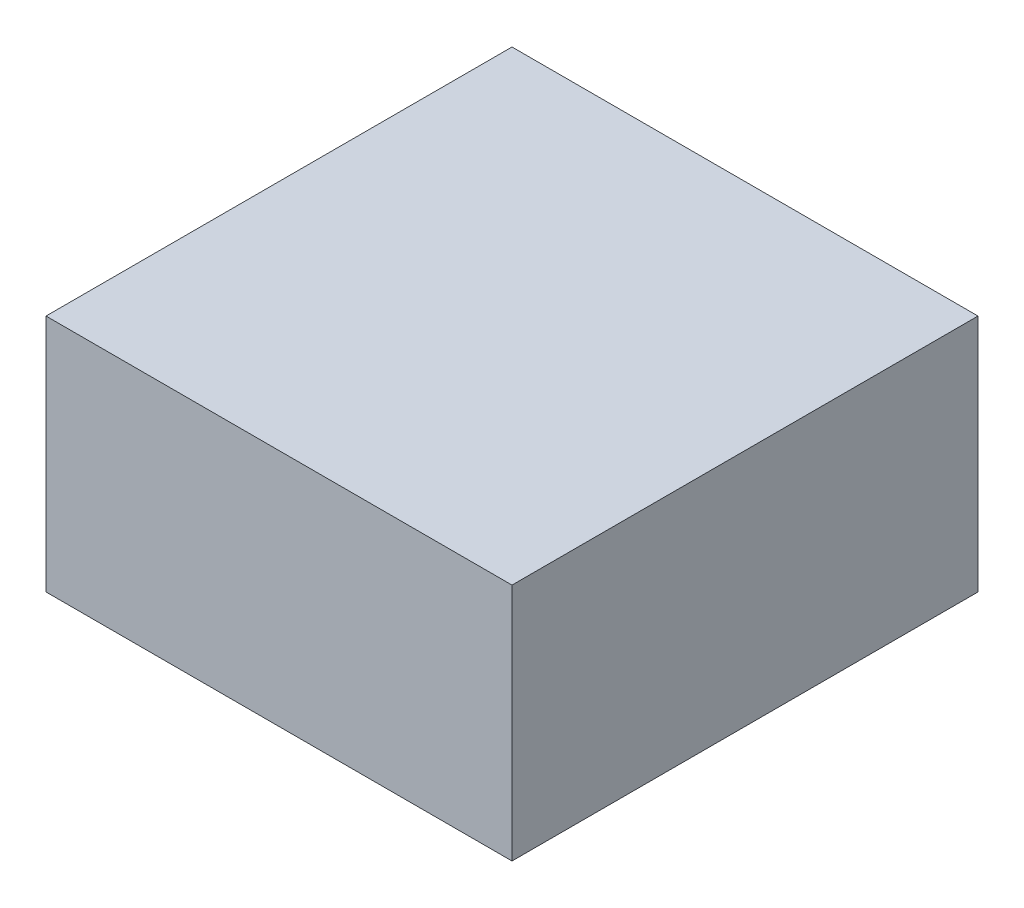
ISO-10303-21;
HEADER;
FILE_DESCRIPTION(('STEP AP214'),'2;1');
FILE_NAME('part.step','',(''),(''),'','','');
FILE_SCHEMA(('AUTOMOTIVE_DESIGN { 1 0 10303 214 1 1 1 1 }'));
ENDSEC;
DATA;
#1=APPLICATION_CONTEXT('core data for automotive mechanical design processes');
#2=APPLICATION_PROTOCOL_DEFINITION('international standard','automotive_design',2000,#1);
#3=PRODUCT_CONTEXT('',#1,'mechanical');
#4=PRODUCT('Part','Part','',(#3));
#5=PRODUCT_RELATED_PRODUCT_CATEGORY('part','',(#4));
#6=PRODUCT_DEFINITION_FORMATION('','',#4);
#7=PRODUCT_DEFINITION_CONTEXT('part definition',#1,'design');
#8=PRODUCT_DEFINITION('design','',#6,#7);
#9=PRODUCT_DEFINITION_SHAPE('','',#8);
#10=(LENGTH_UNIT() NAMED_UNIT(*) SI_UNIT(.MILLI.,.METRE.));
#11=(NAMED_UNIT(*) PLANE_ANGLE_UNIT() SI_UNIT($,.RADIAN.));
#12=(NAMED_UNIT(*) SI_UNIT($,.STERADIAN.) SOLID_ANGLE_UNIT());
#13=UNCERTAINTY_MEASURE_WITH_UNIT(LENGTH_MEASURE(1.E-05),#10,'distance_accuracy_value','');
#14=(GEOMETRIC_REPRESENTATION_CONTEXT(3) GLOBAL_UNCERTAINTY_ASSIGNED_CONTEXT((#13)) GLOBAL_UNIT_ASSIGNED_CONTEXT((#10,
#11,#12)) REPRESENTATION_CONTEXT('',''));
#15=CARTESIAN_POINT('',(0.,0.,0.));
#16=DIRECTION('',(0.,0.,1.));
#17=DIRECTION('',(1.,0.,0.));
#18=AXIS2_PLACEMENT_3D('',#15,#16,#17);
#19=CARTESIAN_POINT('',(-3.58428571428571,3.,-3.15714285714286));
#20=DIRECTION('',(1.,0.,0.));
#21=DIRECTION('',(0.,0.,-1.));
#22=AXIS2_PLACEMENT_3D('',#19,#20,#21);
#23=PLANE('',#22);
#24=DIRECTION('',(0.,0.,1.));
#25=VECTOR('',#24,1.);
#26=CARTESIAN_POINT('',(-3.58428571428571,0.,-3.15714285714286));
#27=LINE('',#26,#25);
#28=CARTESIAN_POINT('',(-3.58428571428571,0.,-3.15714285714286));
#29=VERTEX_POINT('',#28);
#30=CARTESIAN_POINT('',(-3.58428571428571,0.,4.64285714285714));
#31=VERTEX_POINT('',#30);
#32=EDGE_CURVE('E171',#29,#31,#27,.T.);
#33=ORIENTED_EDGE('',*,*,#32,.T.);
#34=DIRECTION('',(0.,-1.,0.));
#35=VECTOR('',#34,1.);
#36=CARTESIAN_POINT('',(-3.58428571428571,3.,4.64285714285714));
#37=LINE('',#36,#35);
#38=CARTESIAN_POINT('',(-3.58428571428571,4.,4.64285714285714));
#39=VERTEX_POINT('',#38);
#40=EDGE_CURVE('E11',#39,#31,#37,.T.);
#41=ORIENTED_EDGE('',*,*,#40,.F.);
#42=DIRECTION('',(0.,0.,1.));
#43=VECTOR('',#42,1.);
#44=CARTESIAN_POINT('',(-3.58428571428571,4.,-3.15714285714286));
#45=LINE('',#44,#43);
#46=CARTESIAN_POINT('',(-3.58428571428571,4.,-3.15714285714286));
#47=VERTEX_POINT('',#46);
#48=EDGE_CURVE('E159',#47,#39,#45,.T.);
#49=ORIENTED_EDGE('',*,*,#48,.F.);
#50=DIRECTION('',(0.,-1.,0.));
#51=VECTOR('',#50,1.);
#52=CARTESIAN_POINT('',(-3.58428571428571,3.,-3.15714285714286));
#53=LINE('',#52,#51);
#54=EDGE_CURVE('E183',#47,#29,#53,.T.);
#55=ORIENTED_EDGE('',*,*,#54,.T.);
#56=EDGE_LOOP('',(#33,#41,#49,#55));
#57=FACE_BOUND('',#56,.T.);
#58=ADVANCED_FACE('F39',(#57),#23,.F.);
#59=CARTESIAN_POINT('',(-3.58428571428571,3.,4.64285714285714));
#60=DIRECTION('',(0.,0.,-1.));
#61=DIRECTION('',(-1.,0.,0.));
#62=AXIS2_PLACEMENT_3D('',#59,#60,#61);
#63=PLANE('',#62);
#64=DIRECTION('',(1.,0.,0.));
#65=VECTOR('',#64,1.);
#66=CARTESIAN_POINT('',(-3.58428571428571,0.,4.64285714285714));
#67=LINE('',#66,#65);
#68=CARTESIAN_POINT('',(4.21571428571429,0.,4.64285714285714));
#69=VERTEX_POINT('',#68);
#70=EDGE_CURVE('E175',#31,#69,#67,.T.);
#71=ORIENTED_EDGE('',*,*,#70,.T.);
#72=DIRECTION('',(0.,-1.,0.));
#73=VECTOR('',#72,1.);
#74=CARTESIAN_POINT('',(4.21571428571429,3.,4.64285714285714));
#75=LINE('',#74,#73);
#76=CARTESIAN_POINT('',(4.21571428571429,4.,4.64285714285714));
#77=VERTEX_POINT('',#76);
#78=EDGE_CURVE('E47',#77,#69,#75,.T.);
#79=ORIENTED_EDGE('',*,*,#78,.F.);
#80=DIRECTION('',(1.,0.,0.));
#81=VECTOR('',#80,1.);
#82=CARTESIAN_POINT('',(-3.58428571428571,4.,4.64285714285714));
#83=LINE('',#82,#81);
#84=EDGE_CURVE('E163',#39,#77,#83,.T.);
#85=ORIENTED_EDGE('',*,*,#84,.F.);
#86=ORIENTED_EDGE('',*,*,#40,.T.);
#87=EDGE_LOOP('',(#71,#79,#85,#86));
#88=FACE_BOUND('',#87,.T.);
#89=ADVANCED_FACE('F205',(#88),#63,.F.);
#90=CARTESIAN_POINT('',(4.21571428571429,3.,-3.15714285714286));
#91=DIRECTION('',(-1.,0.,0.));
#92=DIRECTION('',(0.,0.,1.));
#93=AXIS2_PLACEMENT_3D('',#90,#91,#92);
#94=PLANE('',#93);
#95=DIRECTION('',(0.,0.,-1.));
#96=VECTOR('',#95,1.);
#97=CARTESIAN_POINT('',(4.21571428571429,0.,-3.15714285714286));
#98=LINE('',#97,#96);
#99=CARTESIAN_POINT('',(4.21571428571429,0.,-3.15714285714286));
#100=VERTEX_POINT('',#99);
#101=EDGE_CURVE('E178',#69,#100,#98,.T.);
#102=ORIENTED_EDGE('',*,*,#101,.T.);
#103=DIRECTION('',(0.,-1.,0.));
#104=VECTOR('',#103,1.);
#105=CARTESIAN_POINT('',(4.21571428571429,3.,-3.15714285714286));
#106=LINE('',#105,#104);
#107=CARTESIAN_POINT('',(4.21571428571429,4.,-3.15714285714286));
#108=VERTEX_POINT('',#107);
#109=EDGE_CURVE('E186',#108,#100,#106,.T.);
#110=ORIENTED_EDGE('',*,*,#109,.F.);
#111=DIRECTION('',(0.,0.,-1.));
#112=VECTOR('',#111,1.);
#113=CARTESIAN_POINT('',(4.21571428571429,4.,4.64285714285714));
#114=LINE('',#113,#112);
#115=EDGE_CURVE('E167',#77,#108,#114,.T.);
#116=ORIENTED_EDGE('',*,*,#115,.F.);
#117=ORIENTED_EDGE('',*,*,#78,.T.);
#118=EDGE_LOOP('',(#102,#110,#116,#117));
#119=FACE_BOUND('',#118,.T.);
#120=ADVANCED_FACE('F193',(#119),#94,.F.);
#121=CARTESIAN_POINT('',(-3.58428571428571,3.,-3.15714285714286));
#122=DIRECTION('',(0.,0.,1.));
#123=DIRECTION('',(1.,0.,0.));
#124=AXIS2_PLACEMENT_3D('',#121,#122,#123);
#125=PLANE('',#124);
#126=DIRECTION('',(-1.,0.,0.));
#127=VECTOR('',#126,1.);
#128=CARTESIAN_POINT('',(-3.58428571428571,0.,-3.15714285714286));
#129=LINE('',#128,#127);
#130=EDGE_CURVE('E62',#100,#29,#129,.T.);
#131=ORIENTED_EDGE('',*,*,#130,.T.);
#132=ORIENTED_EDGE('',*,*,#54,.F.);
#133=DIRECTION('',(-1.,0.,0.));
#134=VECTOR('',#133,1.);
#135=CARTESIAN_POINT('',(4.21571428571429,4.,-3.15714285714286));
#136=LINE('',#135,#134);
#137=EDGE_CURVE('E150',#108,#47,#136,.T.);
#138=ORIENTED_EDGE('',*,*,#137,.F.);
#139=ORIENTED_EDGE('',*,*,#109,.T.);
#140=EDGE_LOOP('',(#131,#132,#138,#139));
#141=FACE_BOUND('',#140,.T.);
#142=ADVANCED_FACE('F202',(#141),#125,.F.);
#143=CARTESIAN_POINT('',(0.,0.,0.));
#144=DIRECTION('',(0.,1.,0.));
#145=DIRECTION('',(0.,0.,1.));
#146=AXIS2_PLACEMENT_3D('',#143,#144,#145);
#147=PLANE('',#146);
#148=DIRECTION('',(0.,0.,-1.));
#149=VECTOR('',#148,1.);
#150=CARTESIAN_POINT('',(-1.17994999562325,0.,-0.756446224323053));
#151=LINE('',#150,#149);
#152=CARTESIAN_POINT('',(-1.17994999562325,0.,2.24216051003736));
#153=VERTEX_POINT('',#152);
#154=CARTESIAN_POINT('',(-1.17994999562325,0.,-0.756446224323053));
#155=VERTEX_POINT('',#154);
#156=EDGE_CURVE('E137',#153,#155,#151,.T.);
#157=ORIENTED_EDGE('',*,*,#156,.F.);
#158=DIRECTION('',(-1.,0.,0.));
#159=VECTOR('',#158,1.);
#160=CARTESIAN_POINT('',(0.319353371556958,0.,2.24216051003736));
#161=LINE('',#160,#159);
#162=CARTESIAN_POINT('',(1.81865673873716,0.,2.24216051003736));
#163=VERTEX_POINT('',#162);
#164=EDGE_CURVE('E109',#163,#153,#161,.T.);
#165=ORIENTED_EDGE('',*,*,#164,.F.);
#166=DIRECTION('',(0.,0.,1.));
#167=VECTOR('',#166,1.);
#168=CARTESIAN_POINT('',(1.81865673873716,0.,2.24216051003736));
#169=LINE('',#168,#167);
#170=CARTESIAN_POINT('',(1.81865673873716,0.,-0.756446224323053));
#171=VERTEX_POINT('',#170);
#172=EDGE_CURVE('E130',#171,#163,#169,.T.);
#173=ORIENTED_EDGE('',*,*,#172,.F.);
#174=DIRECTION('',(1.,0.,0.));
#175=VECTOR('',#174,1.);
#176=CARTESIAN_POINT('',(1.81865673873716,0.,-0.756446224323053));
#177=LINE('',#176,#175);
#178=EDGE_CURVE('E140',#155,#171,#177,.T.);
#179=ORIENTED_EDGE('',*,*,#178,.F.);
#180=EDGE_LOOP('',(#157,#165,#173,#179));
#181=FACE_BOUND('',#180,.T.);
#182=ORIENTED_EDGE('',*,*,#32,.F.);
#183=ORIENTED_EDGE('',*,*,#130,.F.);
#184=ORIENTED_EDGE('',*,*,#101,.F.);
#185=ORIENTED_EDGE('',*,*,#70,.F.);
#186=EDGE_LOOP('',(#182,#183,#184,#185));
#187=FACE_BOUND('',#186,.T.);
#188=ADVANCED_FACE('F198',(#181,#187),#147,.F.);
#189=CARTESIAN_POINT('',(0.,4.,0.));
#190=DIRECTION('',(0.,1.,0.));
#191=DIRECTION('',(0.,0.,1.));
#192=AXIS2_PLACEMENT_3D('',#189,#190,#191);
#193=PLANE('',#192);
#194=ORIENTED_EDGE('',*,*,#137,.T.);
#195=ORIENTED_EDGE('',*,*,#48,.T.);
#196=ORIENTED_EDGE('',*,*,#84,.T.);
#197=ORIENTED_EDGE('',*,*,#115,.T.);
#198=EDGE_LOOP('',(#194,#195,#196,#197));
#199=FACE_BOUND('',#198,.T.);
#200=ADVANCED_FACE('F204',(#199),#193,.T.);
#201=CARTESIAN_POINT('',(0.319353371556958,3.,2.24216051003736));
#202=DIRECTION('',(0.,0.,1.));
#203=DIRECTION('',(1.,0.,0.));
#204=AXIS2_PLACEMENT_3D('',#201,#202,#203);
#205=PLANE('',#204);
#206=ORIENTED_EDGE('',*,*,#164,.T.);
#207=DIRECTION('',(0.,-1.,0.));
#208=VECTOR('',#207,1.);
#209=CARTESIAN_POINT('',(-1.17994999562325,3.,2.24216051003736));
#210=LINE('',#209,#208);
#211=CARTESIAN_POINT('',(-1.17994999562325,3.,2.24216051003736));
#212=VERTEX_POINT('',#211);
#213=EDGE_CURVE('E54',#212,#153,#210,.T.);
#214=ORIENTED_EDGE('',*,*,#213,.F.);
#215=DIRECTION('',(-1.,0.,0.));
#216=VECTOR('',#215,1.);
#217=CARTESIAN_POINT('',(-1.17994999562325,3.,2.24216051003736));
#218=LINE('',#217,#216);
#219=CARTESIAN_POINT('',(1.81865673873716,3.,2.24216051003736));
#220=VERTEX_POINT('',#219);
#221=EDGE_CURVE('E106',#220,#212,#218,.T.);
#222=ORIENTED_EDGE('',*,*,#221,.F.);
#223=DIRECTION('',(0.,-1.,0.));
#224=VECTOR('',#223,1.);
#225=CARTESIAN_POINT('',(1.81865673873716,3.,2.24216051003736));
#226=LINE('',#225,#224);
#227=EDGE_CURVE('E147',#220,#163,#226,.T.);
#228=ORIENTED_EDGE('',*,*,#227,.T.);
#229=EDGE_LOOP('',(#206,#214,#222,#228));
#230=FACE_BOUND('',#229,.T.);
#231=ADVANCED_FACE('F104',(#230),#205,.F.);
#232=CARTESIAN_POINT('',(1.81865673873716,3.,2.24216051003736));
#233=DIRECTION('',(1.,0.,0.));
#234=DIRECTION('',(0.,0.,-1.));
#235=AXIS2_PLACEMENT_3D('',#232,#233,#234);
#236=PLANE('',#235);
#237=ORIENTED_EDGE('',*,*,#172,.T.);
#238=ORIENTED_EDGE('',*,*,#227,.F.);
#239=DIRECTION('',(0.,0.,1.));
#240=VECTOR('',#239,1.);
#241=CARTESIAN_POINT('',(1.81865673873716,3.,2.24216051003736));
#242=LINE('',#241,#240);
#243=CARTESIAN_POINT('',(1.81865673873716,3.,-0.756446224323053));
#244=VERTEX_POINT('',#243);
#245=EDGE_CURVE('E113',#244,#220,#242,.T.);
#246=ORIENTED_EDGE('',*,*,#245,.F.);
#247=DIRECTION('',(0.,-1.,0.));
#248=VECTOR('',#247,1.);
#249=CARTESIAN_POINT('',(1.81865673873716,3.,-0.756446224323053));
#250=LINE('',#249,#248);
#251=EDGE_CURVE('E151',#244,#171,#250,.T.);
#252=ORIENTED_EDGE('',*,*,#251,.T.);
#253=EDGE_LOOP('',(#237,#238,#246,#252));
#254=FACE_BOUND('',#253,.T.);
#255=ADVANCED_FACE('F225',(#254),#236,.F.);
#256=CARTESIAN_POINT('',(1.81865673873716,3.,-0.756446224323053));
#257=DIRECTION('',(0.,0.,-1.));
#258=DIRECTION('',(-1.,0.,0.));
#259=AXIS2_PLACEMENT_3D('',#256,#257,#258);
#260=PLANE('',#259);
#261=ORIENTED_EDGE('',*,*,#178,.T.);
#262=ORIENTED_EDGE('',*,*,#251,.F.);
#263=DIRECTION('',(1.,0.,0.));
#264=VECTOR('',#263,1.);
#265=CARTESIAN_POINT('',(1.81865673873716,3.,-0.756446224323053));
#266=LINE('',#265,#264);
#267=CARTESIAN_POINT('',(-1.17994999562325,3.,-0.756446224323053));
#268=VERTEX_POINT('',#267);
#269=EDGE_CURVE('E122',#268,#244,#266,.T.);
#270=ORIENTED_EDGE('',*,*,#269,.F.);
#271=DIRECTION('',(0.,-1.,0.));
#272=VECTOR('',#271,1.);
#273=CARTESIAN_POINT('',(-1.17994999562325,3.,-0.756446224323053));
#274=LINE('',#273,#272);
#275=EDGE_CURVE('E112',#268,#155,#274,.T.);
#276=ORIENTED_EDGE('',*,*,#275,.T.);
#277=EDGE_LOOP('',(#261,#262,#270,#276));
#278=FACE_BOUND('',#277,.T.);
#279=ADVANCED_FACE('F222',(#278),#260,.F.);
#280=CARTESIAN_POINT('',(-1.17994999562325,3.,-0.756446224323053));
#281=DIRECTION('',(-1.,0.,0.));
#282=DIRECTION('',(0.,0.,1.));
#283=AXIS2_PLACEMENT_3D('',#280,#281,#282);
#284=PLANE('',#283);
#285=ORIENTED_EDGE('',*,*,#156,.T.);
#286=ORIENTED_EDGE('',*,*,#275,.F.);
#287=DIRECTION('',(0.,0.,-1.));
#288=VECTOR('',#287,1.);
#289=CARTESIAN_POINT('',(-1.17994999562325,3.,-0.756446224323053));
#290=LINE('',#289,#288);
#291=EDGE_CURVE('E116',#212,#268,#290,.T.);
#292=ORIENTED_EDGE('',*,*,#291,.F.);
#293=ORIENTED_EDGE('',*,*,#213,.T.);
#294=EDGE_LOOP('',(#285,#286,#292,#293));
#295=FACE_BOUND('',#294,.T.);
#296=ADVANCED_FACE('F117',(#295),#284,.F.);
#297=CARTESIAN_POINT('',(0.,3.,0.));
#298=DIRECTION('',(0.,1.,0.));
#299=DIRECTION('',(0.,0.,1.));
#300=AXIS2_PLACEMENT_3D('',#297,#298,#299);
#301=PLANE('',#300);
#302=ORIENTED_EDGE('',*,*,#221,.T.);
#303=ORIENTED_EDGE('',*,*,#291,.T.);
#304=ORIENTED_EDGE('',*,*,#269,.T.);
#305=ORIENTED_EDGE('',*,*,#245,.T.);
#306=EDGE_LOOP('',(#302,#303,#304,#305));
#307=FACE_BOUND('',#306,.T.);
#308=ADVANCED_FACE('F125',(#307),#301,.F.);
#309=CLOSED_SHELL('',(#58,#89,#120,#142,#188,#200,#231,#255,#279,#296,#308));
#310=MANIFOLD_SOLID_BREP('B2',#309);
#311=ADVANCED_BREP_SHAPE_REPRESENTATION('',(#18,#310),#14);
#312=SHAPE_DEFINITION_REPRESENTATION(#9,#311);
ENDSEC;
END-ISO-10303-21;
